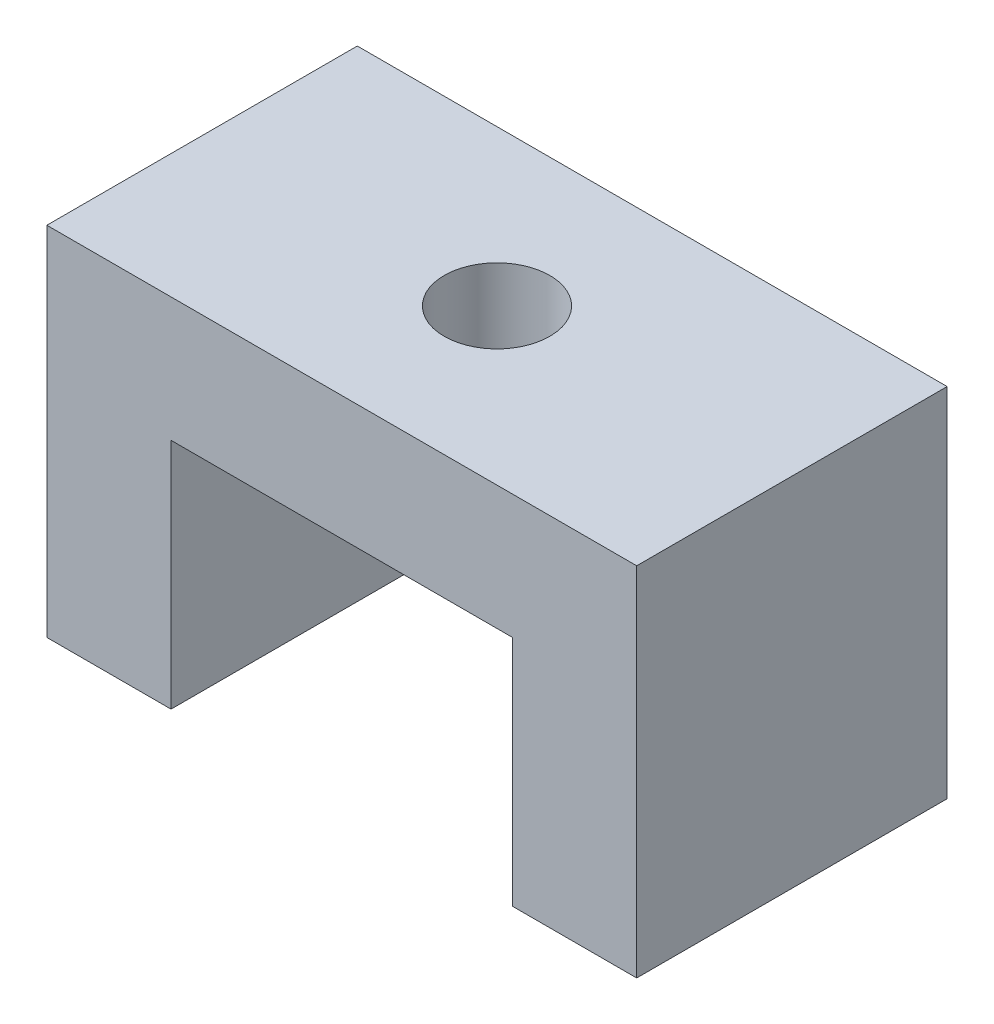
ISO-10303-21;
HEADER;
FILE_DESCRIPTION(('STEP AP214'),'2;1');
FILE_NAME('part.step','',(''),(''),'','','');
FILE_SCHEMA(('AUTOMOTIVE_DESIGN { 1 0 10303 214 1 1 1 1 }'));
ENDSEC;
DATA;
#1=APPLICATION_CONTEXT('core data for automotive mechanical design processes');
#2=APPLICATION_PROTOCOL_DEFINITION('international standard','automotive_design',2000,#1);
#3=PRODUCT_CONTEXT('',#1,'mechanical');
#4=PRODUCT('Part','Part','',(#3));
#5=PRODUCT_RELATED_PRODUCT_CATEGORY('part','',(#4));
#6=PRODUCT_DEFINITION_FORMATION('','',#4);
#7=PRODUCT_DEFINITION_CONTEXT('part definition',#1,'design');
#8=PRODUCT_DEFINITION('design','',#6,#7);
#9=PRODUCT_DEFINITION_SHAPE('','',#8);
#10=(LENGTH_UNIT() NAMED_UNIT(*) SI_UNIT(.MILLI.,.METRE.));
#11=(NAMED_UNIT(*) PLANE_ANGLE_UNIT() SI_UNIT($,.RADIAN.));
#12=(NAMED_UNIT(*) SI_UNIT($,.STERADIAN.) SOLID_ANGLE_UNIT());
#13=UNCERTAINTY_MEASURE_WITH_UNIT(LENGTH_MEASURE(1.E-05),#10,'distance_accuracy_value','');
#14=(GEOMETRIC_REPRESENTATION_CONTEXT(3) GLOBAL_UNCERTAINTY_ASSIGNED_CONTEXT((#13)) GLOBAL_UNIT_ASSIGNED_CONTEXT((#10,
#11,#12)) REPRESENTATION_CONTEXT('',''));
#15=CARTESIAN_POINT('',(0.,0.,0.));
#16=DIRECTION('',(0.,0.,1.));
#17=DIRECTION('',(1.,0.,0.));
#18=AXIS2_PLACEMENT_3D('',#15,#16,#17);
#19=CARTESIAN_POINT('',(0.,15.,0.));
#20=DIRECTION('',(0.,1.,0.));
#21=DIRECTION('',(0.,0.,1.));
#22=AXIS2_PLACEMENT_3D('',#19,#20,#21);
#23=PLANE('',#22);
#24=CARTESIAN_POINT('',(0.,15.,0.));
#25=DIRECTION('',(0.,1.,0.));
#26=DIRECTION('',(0.,0.,1.));
#27=AXIS2_PLACEMENT_3D('',#24,#25,#26);
#28=CIRCLE('',#27,3.4);
#29=CARTESIAN_POINT('',(0.,15.,3.4));
#30=VERTEX_POINT('',#29);
#31=EDGE_CURVE('E179',#30,#30,#28,.T.);
#32=ORIENTED_EDGE('',*,*,#31,.T.);
#33=EDGE_LOOP('',(#32));
#34=FACE_BOUND('',#33,.T.);
#35=DIRECTION('',(0.,0.,-1.));
#36=VECTOR('',#35,1.);
#37=CARTESIAN_POINT('',(-11.,15.,0.));
#38=LINE('',#37,#36);
#39=CARTESIAN_POINT('',(-11.,15.,10.));
#40=VERTEX_POINT('',#39);
#41=CARTESIAN_POINT('',(-11.,15.,-10.));
#42=VERTEX_POINT('',#41);
#43=EDGE_CURVE('E138',#40,#42,#38,.T.);
#44=ORIENTED_EDGE('',*,*,#43,.T.);
#45=DIRECTION('',(-1.,0.,0.));
#46=VECTOR('',#45,1.);
#47=CARTESIAN_POINT('',(19.,15.,-10.));
#48=LINE('',#47,#46);
#49=CARTESIAN_POINT('',(11.,15.,-10.));
#50=VERTEX_POINT('',#49);
#51=EDGE_CURVE('E54',#50,#42,#48,.T.);
#52=ORIENTED_EDGE('',*,*,#51,.F.);
#53=DIRECTION('',(0.,0.,-1.));
#54=VECTOR('',#53,1.);
#55=CARTESIAN_POINT('',(11.,15.,0.));
#56=LINE('',#55,#54);
#57=CARTESIAN_POINT('',(11.,15.,10.));
#58=VERTEX_POINT('',#57);
#59=EDGE_CURVE('E76',#58,#50,#56,.T.);
#60=ORIENTED_EDGE('',*,*,#59,.F.);
#61=DIRECTION('',(1.,0.,0.));
#62=VECTOR('',#61,1.);
#63=CARTESIAN_POINT('',(-19.,15.,10.));
#64=LINE('',#63,#62);
#65=EDGE_CURVE('E103',#40,#58,#64,.T.);
#66=ORIENTED_EDGE('',*,*,#65,.F.);
#67=EDGE_LOOP('',(#44,#52,#60,#66));
#68=FACE_BOUND('',#67,.T.);
#69=ADVANCED_FACE('F38',(#34,#68),#23,.F.);
#70=CARTESIAN_POINT('',(0.,15.,10.));
#71=DIRECTION('',(0.,0.,1.));
#72=DIRECTION('',(1.,0.,0.));
#73=AXIS2_PLACEMENT_3D('',#70,#71,#72);
#74=PLANE('',#73);
#75=DIRECTION('',(-1.,0.,0.));
#76=VECTOR('',#75,1.);
#77=CARTESIAN_POINT('',(0.,0.,10.));
#78=LINE('',#77,#76);
#79=CARTESIAN_POINT('',(19.,0.,10.));
#80=VERTEX_POINT('',#79);
#81=CARTESIAN_POINT('',(11.,0.,10.));
#82=VERTEX_POINT('',#81);
#83=EDGE_CURVE('E93',#80,#82,#78,.T.);
#84=ORIENTED_EDGE('',*,*,#83,.F.);
#85=DIRECTION('',(0.,-1.,0.));
#86=VECTOR('',#85,1.);
#87=CARTESIAN_POINT('',(19.,15.,10.));
#88=LINE('',#87,#86);
#89=CARTESIAN_POINT('',(19.,23.,10.));
#90=VERTEX_POINT('',#89);
#91=EDGE_CURVE('E11',#90,#80,#88,.T.);
#92=ORIENTED_EDGE('',*,*,#91,.F.);
#93=DIRECTION('',(1.,0.,0.));
#94=VECTOR('',#93,1.);
#95=CARTESIAN_POINT('',(-19.,23.,10.));
#96=LINE('',#95,#94);
#97=CARTESIAN_POINT('',(-19.,23.,10.));
#98=VERTEX_POINT('',#97);
#99=EDGE_CURVE('E164',#98,#90,#96,.T.);
#100=ORIENTED_EDGE('',*,*,#99,.F.);
#101=DIRECTION('',(0.,-1.,0.));
#102=VECTOR('',#101,1.);
#103=CARTESIAN_POINT('',(-19.,23.,10.));
#104=LINE('',#103,#102);
#105=CARTESIAN_POINT('',(-19.,0.,10.));
#106=VERTEX_POINT('',#105);
#107=EDGE_CURVE('E157',#98,#106,#104,.T.);
#108=ORIENTED_EDGE('',*,*,#107,.T.);
#109=DIRECTION('',(1.,0.,0.));
#110=VECTOR('',#109,1.);
#111=CARTESIAN_POINT('',(0.,0.,10.));
#112=LINE('',#111,#110);
#113=CARTESIAN_POINT('',(-11.,0.,10.));
#114=VERTEX_POINT('',#113);
#115=EDGE_CURVE('E147',#106,#114,#112,.T.);
#116=ORIENTED_EDGE('',*,*,#115,.T.);
#117=DIRECTION('',(0.,-1.,0.));
#118=VECTOR('',#117,1.);
#119=CARTESIAN_POINT('',(-11.,15.,10.));
#120=LINE('',#119,#118);
#121=EDGE_CURVE('E140',#40,#114,#120,.T.);
#122=ORIENTED_EDGE('',*,*,#121,.F.);
#123=ORIENTED_EDGE('',*,*,#65,.T.);
#124=DIRECTION('',(0.,-1.,0.));
#125=VECTOR('',#124,1.);
#126=CARTESIAN_POINT('',(11.,15.,10.));
#127=LINE('',#126,#125);
#128=EDGE_CURVE('E78',#58,#82,#127,.T.);
#129=ORIENTED_EDGE('',*,*,#128,.T.);
#130=EDGE_LOOP('',(#84,#92,#100,#108,#116,#122,#123,#129));
#131=FACE_BOUND('',#130,.T.);
#132=ADVANCED_FACE('F40',(#131),#74,.T.);
#133=CARTESIAN_POINT('',(19.,15.,0.));
#134=DIRECTION('',(-1.,0.,0.));
#135=DIRECTION('',(0.,0.,1.));
#136=AXIS2_PLACEMENT_3D('',#133,#134,#135);
#137=PLANE('',#136);
#138=DIRECTION('',(0.,0.,-1.));
#139=VECTOR('',#138,1.);
#140=CARTESIAN_POINT('',(19.,0.,0.));
#141=LINE('',#140,#139);
#142=CARTESIAN_POINT('',(19.,0.,-10.));
#143=VERTEX_POINT('',#142);
#144=EDGE_CURVE('E88',#80,#143,#141,.T.);
#145=ORIENTED_EDGE('',*,*,#144,.T.);
#146=DIRECTION('',(0.,-1.,0.));
#147=VECTOR('',#146,1.);
#148=CARTESIAN_POINT('',(19.,15.,-10.));
#149=LINE('',#148,#147);
#150=CARTESIAN_POINT('',(19.,23.,-10.));
#151=VERTEX_POINT('',#150);
#152=EDGE_CURVE('E47',#151,#143,#149,.T.);
#153=ORIENTED_EDGE('',*,*,#152,.F.);
#154=DIRECTION('',(0.,0.,-1.));
#155=VECTOR('',#154,1.);
#156=CARTESIAN_POINT('',(19.,23.,10.));
#157=LINE('',#156,#155);
#158=EDGE_CURVE('E162',#90,#151,#157,.T.);
#159=ORIENTED_EDGE('',*,*,#158,.F.);
#160=ORIENTED_EDGE('',*,*,#91,.T.);
#161=EDGE_LOOP('',(#145,#153,#159,#160));
#162=FACE_BOUND('',#161,.T.);
#163=ADVANCED_FACE('F160',(#162),#137,.F.);
#164=CARTESIAN_POINT('',(0.,15.,-10.));
#165=DIRECTION('',(0.,0.,-1.));
#166=DIRECTION('',(-1.,0.,0.));
#167=AXIS2_PLACEMENT_3D('',#164,#165,#166);
#168=PLANE('',#167);
#169=DIRECTION('',(1.,0.,0.));
#170=VECTOR('',#169,1.);
#171=CARTESIAN_POINT('',(0.,0.,-10.));
#172=LINE('',#171,#170);
#173=CARTESIAN_POINT('',(11.,0.,-10.));
#174=VERTEX_POINT('',#173);
#175=EDGE_CURVE('E81',#174,#143,#172,.T.);
#176=ORIENTED_EDGE('',*,*,#175,.F.);
#177=DIRECTION('',(0.,-1.,0.));
#178=VECTOR('',#177,1.);
#179=CARTESIAN_POINT('',(11.,15.,-10.));
#180=LINE('',#179,#178);
#181=EDGE_CURVE('E70',#50,#174,#180,.T.);
#182=ORIENTED_EDGE('',*,*,#181,.F.);
#183=ORIENTED_EDGE('',*,*,#51,.T.);
#184=DIRECTION('',(0.,-1.,0.));
#185=VECTOR('',#184,1.);
#186=CARTESIAN_POINT('',(-11.,15.,-10.));
#187=LINE('',#186,#185);
#188=CARTESIAN_POINT('',(-11.,0.,-10.));
#189=VERTEX_POINT('',#188);
#190=EDGE_CURVE('E143',#42,#189,#187,.T.);
#191=ORIENTED_EDGE('',*,*,#190,.T.);
#192=DIRECTION('',(-1.,0.,0.));
#193=VECTOR('',#192,1.);
#194=CARTESIAN_POINT('',(0.,0.,-10.));
#195=LINE('',#194,#193);
#196=CARTESIAN_POINT('',(-19.,0.,-10.));
#197=VERTEX_POINT('',#196);
#198=EDGE_CURVE('E174',#189,#197,#195,.T.);
#199=ORIENTED_EDGE('',*,*,#198,.T.);
#200=DIRECTION('',(0.,-1.,0.));
#201=VECTOR('',#200,1.);
#202=CARTESIAN_POINT('',(-19.,23.,-10.));
#203=LINE('',#202,#201);
#204=CARTESIAN_POINT('',(-19.,23.,-10.));
#205=VERTEX_POINT('',#204);
#206=EDGE_CURVE('E155',#205,#197,#203,.T.);
#207=ORIENTED_EDGE('',*,*,#206,.F.);
#208=DIRECTION('',(-1.,0.,0.));
#209=VECTOR('',#208,1.);
#210=CARTESIAN_POINT('',(19.,23.,-10.));
#211=LINE('',#210,#209);
#212=EDGE_CURVE('E110',#151,#205,#211,.T.);
#213=ORIENTED_EDGE('',*,*,#212,.F.);
#214=ORIENTED_EDGE('',*,*,#152,.T.);
#215=EDGE_LOOP('',(#176,#182,#183,#191,#199,#207,#213,#214));
#216=FACE_BOUND('',#215,.T.);
#217=ADVANCED_FACE('F82',(#216),#168,.T.);
#218=CARTESIAN_POINT('',(11.,15.,0.));
#219=DIRECTION('',(-1.,0.,0.));
#220=DIRECTION('',(0.,0.,1.));
#221=AXIS2_PLACEMENT_3D('',#218,#219,#220);
#222=PLANE('',#221);
#223=DIRECTION('',(0.,0.,-1.));
#224=VECTOR('',#223,1.);
#225=CARTESIAN_POINT('',(11.,0.,0.));
#226=LINE('',#225,#224);
#227=EDGE_CURVE('E75',#82,#174,#226,.T.);
#228=ORIENTED_EDGE('',*,*,#227,.F.);
#229=ORIENTED_EDGE('',*,*,#128,.F.);
#230=ORIENTED_EDGE('',*,*,#59,.T.);
#231=ORIENTED_EDGE('',*,*,#181,.T.);
#232=EDGE_LOOP('',(#228,#229,#230,#231));
#233=FACE_BOUND('',#232,.T.);
#234=ADVANCED_FACE('F72',(#233),#222,.T.);
#235=CARTESIAN_POINT('',(0.,0.,0.));
#236=DIRECTION('',(0.,1.,0.));
#237=DIRECTION('',(0.,0.,1.));
#238=AXIS2_PLACEMENT_3D('',#235,#236,#237);
#239=PLANE('',#238);
#240=CARTESIAN_POINT('',(15.,0.,0.));
#241=DIRECTION('',(0.,1.,0.));
#242=DIRECTION('',(0.,0.,1.));
#243=AXIS2_PLACEMENT_3D('',#240,#241,#242);
#244=CIRCLE('',#243,2.);
#245=CARTESIAN_POINT('',(15.,0.,2.));
#246=VERTEX_POINT('',#245);
#247=EDGE_CURVE('E187',#246,#246,#244,.T.);
#248=ORIENTED_EDGE('',*,*,#247,.T.);
#249=EDGE_LOOP('',(#248));
#250=FACE_BOUND('',#249,.T.);
#251=ORIENTED_EDGE('',*,*,#83,.T.);
#252=ORIENTED_EDGE('',*,*,#227,.T.);
#253=ORIENTED_EDGE('',*,*,#175,.T.);
#254=ORIENTED_EDGE('',*,*,#144,.F.);
#255=EDGE_LOOP('',(#251,#252,#253,#254));
#256=FACE_BOUND('',#255,.T.);
#257=ADVANCED_FACE('F91',(#250,#256),#239,.F.);
#258=CARTESIAN_POINT('',(-19.,23.,-10.));
#259=DIRECTION('',(1.,0.,0.));
#260=DIRECTION('',(0.,0.,-1.));
#261=AXIS2_PLACEMENT_3D('',#258,#259,#260);
#262=PLANE('',#261);
#263=ORIENTED_EDGE('',*,*,#206,.T.);
#264=DIRECTION('',(0.,0.,1.));
#265=VECTOR('',#264,1.);
#266=CARTESIAN_POINT('',(-19.,0.,0.));
#267=LINE('',#266,#265);
#268=EDGE_CURVE('E144',#197,#106,#267,.T.);
#269=ORIENTED_EDGE('',*,*,#268,.T.);
#270=ORIENTED_EDGE('',*,*,#107,.F.);
#271=DIRECTION('',(0.,0.,1.));
#272=VECTOR('',#271,1.);
#273=CARTESIAN_POINT('',(-19.,23.,-10.));
#274=LINE('',#273,#272);
#275=EDGE_CURVE('E150',#205,#98,#274,.T.);
#276=ORIENTED_EDGE('',*,*,#275,.F.);
#277=EDGE_LOOP('',(#263,#269,#270,#276));
#278=FACE_BOUND('',#277,.T.);
#279=ADVANCED_FACE('F224',(#278),#262,.F.);
#280=CARTESIAN_POINT('',(0.,23.,0.));
#281=DIRECTION('',(0.,1.,0.));
#282=DIRECTION('',(0.,0.,1.));
#283=AXIS2_PLACEMENT_3D('',#280,#281,#282);
#284=PLANE('',#283);
#285=CARTESIAN_POINT('',(0.,23.,0.));
#286=DIRECTION('',(0.,1.,0.));
#287=DIRECTION('',(0.,0.,1.));
#288=AXIS2_PLACEMENT_3D('',#285,#286,#287);
#289=CIRCLE('',#288,3.4);
#290=CARTESIAN_POINT('',(0.,23.,3.4));
#291=VERTEX_POINT('',#290);
#292=EDGE_CURVE('E183',#291,#291,#289,.T.);
#293=ORIENTED_EDGE('',*,*,#292,.F.);
#294=EDGE_LOOP('',(#293));
#295=FACE_BOUND('',#294,.T.);
#296=ORIENTED_EDGE('',*,*,#275,.T.);
#297=ORIENTED_EDGE('',*,*,#99,.T.);
#298=ORIENTED_EDGE('',*,*,#158,.T.);
#299=ORIENTED_EDGE('',*,*,#212,.T.);
#300=EDGE_LOOP('',(#296,#297,#298,#299));
#301=FACE_BOUND('',#300,.T.);
#302=ADVANCED_FACE('F165',(#295,#301),#284,.T.);
#303=CARTESIAN_POINT('',(-11.,15.,0.));
#304=DIRECTION('',(-1.,0.,0.));
#305=DIRECTION('',(0.,0.,1.));
#306=AXIS2_PLACEMENT_3D('',#303,#304,#305);
#307=PLANE('',#306);
#308=DIRECTION('',(0.,0.,-1.));
#309=VECTOR('',#308,1.);
#310=CARTESIAN_POINT('',(-11.,0.,0.));
#311=LINE('',#310,#309);
#312=EDGE_CURVE('E177',#114,#189,#311,.T.);
#313=ORIENTED_EDGE('',*,*,#312,.T.);
#314=ORIENTED_EDGE('',*,*,#190,.F.);
#315=ORIENTED_EDGE('',*,*,#43,.F.);
#316=ORIENTED_EDGE('',*,*,#121,.T.);
#317=EDGE_LOOP('',(#313,#314,#315,#316));
#318=FACE_BOUND('',#317,.T.);
#319=ADVANCED_FACE('F139',(#318),#307,.F.);
#320=CARTESIAN_POINT('',(0.,0.,0.));
#321=DIRECTION('',(0.,1.,0.));
#322=DIRECTION('',(0.,0.,1.));
#323=AXIS2_PLACEMENT_3D('',#320,#321,#322);
#324=PLANE('',#323);
#325=CARTESIAN_POINT('',(-15.,0.,0.));
#326=DIRECTION('',(0.,1.,0.));
#327=DIRECTION('',(0.,0.,1.));
#328=AXIS2_PLACEMENT_3D('',#325,#326,#327);
#329=CIRCLE('',#328,2.);
#330=CARTESIAN_POINT('',(-15.,0.,2.));
#331=VERTEX_POINT('',#330);
#332=EDGE_CURVE('E193',#331,#331,#329,.T.);
#333=ORIENTED_EDGE('',*,*,#332,.T.);
#334=EDGE_LOOP('',(#333));
#335=FACE_BOUND('',#334,.T.);
#336=ORIENTED_EDGE('',*,*,#115,.F.);
#337=ORIENTED_EDGE('',*,*,#268,.F.);
#338=ORIENTED_EDGE('',*,*,#198,.F.);
#339=ORIENTED_EDGE('',*,*,#312,.F.);
#340=EDGE_LOOP('',(#336,#337,#338,#339));
#341=FACE_BOUND('',#340,.T.);
#342=ADVANCED_FACE('F269',(#335,#341),#324,.F.);
#343=CARTESIAN_POINT('',(0.,13.,0.));
#344=DIRECTION('',(0.,1.,0.));
#345=DIRECTION('',(0.,0.,1.));
#346=AXIS2_PLACEMENT_3D('',#343,#344,#345);
#347=CYLINDRICAL_SURFACE('',#346,3.4);
#348=ORIENTED_EDGE('',*,*,#292,.T.);
#349=EDGE_LOOP('',(#348));
#350=FACE_BOUND('',#349,.T.);
#351=ORIENTED_EDGE('',*,*,#31,.F.);
#352=EDGE_LOOP('',(#351));
#353=FACE_BOUND('',#352,.T.);
#354=ADVANCED_FACE('F213',(#350,#353),#347,.F.);
#355=CARTESIAN_POINT('',(-15.,15.,0.));
#356=DIRECTION('',(0.,-1.,0.));
#357=DIRECTION('',(0.,0.,-1.));
#358=AXIS2_PLACEMENT_3D('',#355,#356,#357);
#359=CYLINDRICAL_SURFACE('',#358,2.);
#360=CARTESIAN_POINT('',(-15.,15.,0.));
#361=DIRECTION('',(0.,1.,0.));
#362=DIRECTION('',(0.,0.,1.));
#363=AXIS2_PLACEMENT_3D('',#360,#361,#362);
#364=CIRCLE('',#363,2.);
#365=CARTESIAN_POINT('',(-15.,15.,2.));
#366=VERTEX_POINT('',#365);
#367=EDGE_CURVE('E186',#366,#366,#364,.T.);
#368=ORIENTED_EDGE('',*,*,#367,.T.);
#369=EDGE_LOOP('',(#368));
#370=FACE_BOUND('',#369,.T.);
#371=ORIENTED_EDGE('',*,*,#332,.F.);
#372=EDGE_LOOP('',(#371));
#373=FACE_BOUND('',#372,.T.);
#374=ADVANCED_FACE('F199',(#370,#373),#359,.F.);
#375=CARTESIAN_POINT('',(0.,15.,0.));
#376=DIRECTION('',(0.,1.,0.));
#377=DIRECTION('',(0.,0.,1.));
#378=AXIS2_PLACEMENT_3D('',#375,#376,#377);
#379=PLANE('',#378);
#380=ORIENTED_EDGE('',*,*,#367,.F.);
#381=EDGE_LOOP('',(#380));
#382=FACE_BOUND('',#381,.T.);
#383=ADVANCED_FACE('F202',(#382),#379,.F.);
#384=CARTESIAN_POINT('',(15.,15.,0.));
#385=DIRECTION('',(0.,-1.,0.));
#386=DIRECTION('',(0.,0.,-1.));
#387=AXIS2_PLACEMENT_3D('',#384,#385,#386);
#388=CYLINDRICAL_SURFACE('',#387,2.);
#389=CARTESIAN_POINT('',(15.,15.,0.));
#390=DIRECTION('',(0.,1.,0.));
#391=DIRECTION('',(0.,0.,1.));
#392=AXIS2_PLACEMENT_3D('',#389,#390,#391);
#393=CIRCLE('',#392,2.);
#394=CARTESIAN_POINT('',(15.,15.,2.));
#395=VERTEX_POINT('',#394);
#396=EDGE_CURVE('E190',#395,#395,#393,.T.);
#397=ORIENTED_EDGE('',*,*,#396,.T.);
#398=EDGE_LOOP('',(#397));
#399=FACE_BOUND('',#398,.T.);
#400=ORIENTED_EDGE('',*,*,#247,.F.);
#401=EDGE_LOOP('',(#400));
#402=FACE_BOUND('',#401,.T.);
#403=ADVANCED_FACE('F204',(#399,#402),#388,.F.);
#404=CARTESIAN_POINT('',(0.,15.,0.));
#405=DIRECTION('',(0.,1.,0.));
#406=DIRECTION('',(0.,0.,1.));
#407=AXIS2_PLACEMENT_3D('',#404,#405,#406);
#408=PLANE('',#407);
#409=ORIENTED_EDGE('',*,*,#396,.F.);
#410=EDGE_LOOP('',(#409));
#411=FACE_BOUND('',#410,.T.);
#412=ADVANCED_FACE('F210',(#411),#408,.F.);
#413=CLOSED_SHELL('',(#69,#132,#163,#217,#234,#257,#279,#302,#319,#342,#354,#374,#383,#403,#412));
#414=MANIFOLD_SOLID_BREP('B2',#413);
#415=ADVANCED_BREP_SHAPE_REPRESENTATION('',(#18,#414),#14);
#416=SHAPE_DEFINITION_REPRESENTATION(#9,#415);
ENDSEC;
END-ISO-10303-21;
